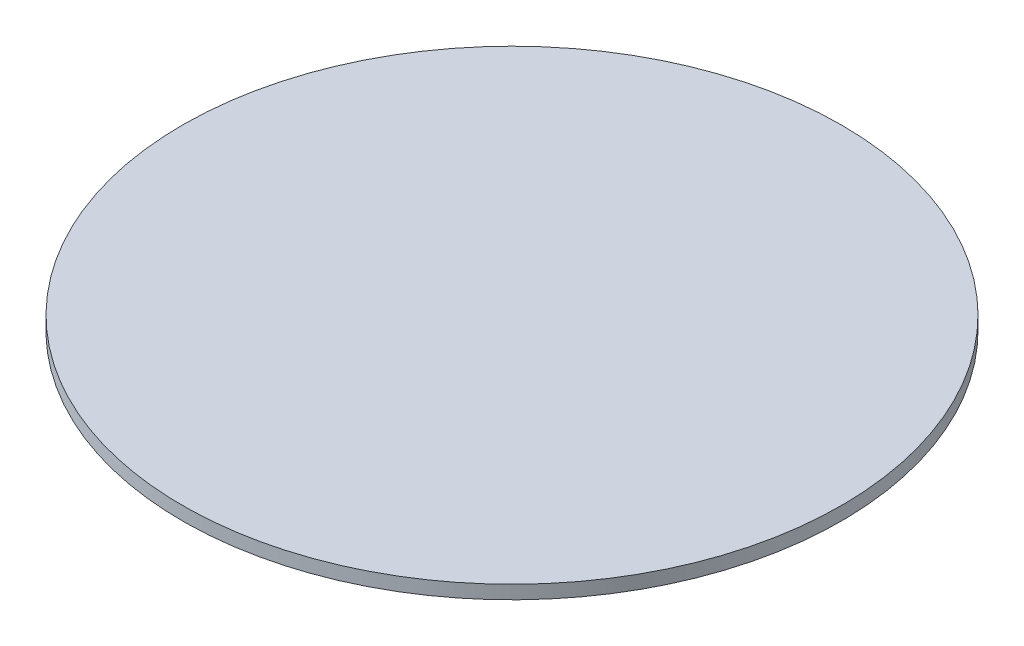
ISO-10303-21;
HEADER;
FILE_DESCRIPTION(('STEP AP214'),'2;1');
FILE_NAME('part.step','',(''),(''),'','','');
FILE_SCHEMA(('AUTOMOTIVE_DESIGN { 1 0 10303 214 1 1 1 1 }'));
ENDSEC;
DATA;
#1=APPLICATION_CONTEXT('core data for automotive mechanical design processes');
#2=APPLICATION_PROTOCOL_DEFINITION('international standard','automotive_design',2000,#1);
#3=PRODUCT_CONTEXT('',#1,'mechanical');
#4=PRODUCT('Part','Part','',(#3));
#5=PRODUCT_RELATED_PRODUCT_CATEGORY('part','',(#4));
#6=PRODUCT_DEFINITION_FORMATION('','',#4);
#7=PRODUCT_DEFINITION_CONTEXT('part definition',#1,'design');
#8=PRODUCT_DEFINITION('design','',#6,#7);
#9=PRODUCT_DEFINITION_SHAPE('','',#8);
#10=(LENGTH_UNIT() NAMED_UNIT(*) SI_UNIT(.MILLI.,.METRE.));
#11=(NAMED_UNIT(*) PLANE_ANGLE_UNIT() SI_UNIT($,.RADIAN.));
#12=(NAMED_UNIT(*) SI_UNIT($,.STERADIAN.) SOLID_ANGLE_UNIT());
#13=UNCERTAINTY_MEASURE_WITH_UNIT(LENGTH_MEASURE(1.E-05),#10,'distance_accuracy_value','');
#14=(GEOMETRIC_REPRESENTATION_CONTEXT(3) GLOBAL_UNCERTAINTY_ASSIGNED_CONTEXT((#13)) GLOBAL_UNIT_ASSIGNED_CONTEXT((#10,
#11,#12)) REPRESENTATION_CONTEXT('',''));
#15=CARTESIAN_POINT('',(0.,0.,0.));
#16=DIRECTION('',(0.,0.,1.));
#17=DIRECTION('',(1.,0.,0.));
#18=AXIS2_PLACEMENT_3D('',#15,#16,#17);
#19=CARTESIAN_POINT('',(0.,1.13671342881194,-27.7636753236815));
#20=CARTESIAN_POINT('',(-1.81711322679221,1.13671342881194,-27.7636753236815));
#21=CARTESIAN_POINT('',(-5.45133968037664,1.13671342881194,-27.4057352601502));
#22=CARTESIAN_POINT('',(-10.6931874339829,1.13671342881194,-25.8156381281192));
#23=CARTESIAN_POINT('',(-15.5241019913098,1.13671342881194,-23.2334605004011));
#24=CARTESIAN_POINT('',(-19.7584340151274,1.13671342881194,-19.7584340151274));
#25=CARTESIAN_POINT('',(-23.2334605004011,1.13671342881194,-15.5241019913099));
#26=CARTESIAN_POINT('',(-25.8156381281191,1.13671342881194,-10.6931874339829));
#27=CARTESIAN_POINT('',(-27.4057352601502,1.13671342881194,-5.45133968037665));
#28=CARTESIAN_POINT('',(-27.9426453554471,1.13671342881194,0.));
#29=CARTESIAN_POINT('',(-27.4057352601502,1.13671342881194,5.45133968037665));
#30=CARTESIAN_POINT('',(-25.8156381281192,1.13671342881194,10.6931874339829));
#31=CARTESIAN_POINT('',(-23.2334605004011,1.13671342881194,15.5241019913099));
#32=CARTESIAN_POINT('',(-19.7584340151274,1.13671342881194,19.7584340151274));
#33=CARTESIAN_POINT('',(-15.5241019913099,1.13671342881194,23.2334605004011));
#34=CARTESIAN_POINT('',(-10.6931874339829,1.13671342881194,25.8156381281191));
#35=CARTESIAN_POINT('',(-5.45133968037666,1.13671342881194,27.4057352601502));
#36=CARTESIAN_POINT('',(0.,1.13671342881194,27.9426453554471));
#37=CARTESIAN_POINT('',(5.45133968037663,1.13671342881194,27.4057352601502));
#38=CARTESIAN_POINT('',(10.6931874339829,1.13671342881194,25.8156381281191));
#39=CARTESIAN_POINT('',(15.5241019913098,1.13671342881194,23.2334605004011));
#40=CARTESIAN_POINT('',(19.7584340151274,1.13671342881194,19.7584340151274));
#41=CARTESIAN_POINT('',(23.2334605004011,1.13671342881194,15.5241019913099));
#42=CARTESIAN_POINT('',(25.8156381281192,1.13671342881194,10.6931874339829));
#43=CARTESIAN_POINT('',(27.4057352601502,1.13671342881194,5.45133968037666));
#44=CARTESIAN_POINT('',(27.9426453554471,1.13671342881194,0.));
#45=CARTESIAN_POINT('',(27.4057352601502,1.13671342881194,-5.45133968037665));
#46=CARTESIAN_POINT('',(25.8156381281191,1.13671342881194,-10.6931874339829));
#47=CARTESIAN_POINT('',(23.2334605004011,1.13671342881194,-15.5241019913099));
#48=CARTESIAN_POINT('',(19.7584340151274,1.13671342881194,-19.7584340151274));
#49=CARTESIAN_POINT('',(15.5241019913099,1.13671342881194,-23.2334605004011));
#50=CARTESIAN_POINT('',(10.6931874339829,1.13671342881194,-25.8156381281191));
#51=CARTESIAN_POINT('',(5.45133968037665,1.13671342881194,-27.4057352601502));
#52=CARTESIAN_POINT('',(1.81711322679222,1.13671342881194,-27.7636753236815));
#53=CARTESIAN_POINT('',(0.,1.13671342881194,-27.7636753236815));
#54=B_SPLINE_CURVE_WITH_KNOTS('',3,(#19,#20,#21,#22,#23,#24,#25,#26,#27,#28,#29,#30,#31,#32,#33,
#34,#35,#36,#37,#38,#39,#40,#41,#42,#43,#44,#45,#46,#47,#48,#49,#50,#51,#52,#53),.UNSPECIFIED.,
.T.,.F.,(4,1,1,1,1,1,1,1,1,1,1,1,1,1,1,1,1,1,1,1,1,1,1,1,1,1,1,1,1,1,1,1,4),(0.,0.03125,0.0625,
0.0937499999999999,0.125,0.15625,0.1875,0.21875,0.25,0.28125,0.3125,0.34375,0.375,0.40625,
0.4375,0.46875,0.5,0.53125,0.5625,0.59375,0.625,0.65625,0.687499999999999,0.71875,0.75,0.78125,
0.8125,0.84375,0.875,0.90625,0.9375,0.96875,1.),.UNSPECIFIED.);
#55=DIRECTION('',(0.,-1.,0.));
#56=VECTOR('',#55,1.);
#57=SURFACE_OF_LINEAR_EXTRUSION('',#54,#56);
#58=CARTESIAN_POINT('',(0.,1.13671342881194,-27.7636753236815));
#59=CARTESIAN_POINT('',(0.454281096131213,1.13671342881194,-27.7636752294538));
#60=CARTESIAN_POINT('',(0.908558886062405,1.13671342881194,-27.752489563112));
#61=CARTESIAN_POINT('',(1.81602337486819,1.13671342881194,-27.7078546133229));
#62=CARTESIAN_POINT('',(2.26921006523989,1.13671342881194,-27.6744051569351));
#63=CARTESIAN_POINT('',(3.17340078485465,1.13671342881194,-27.5853501575235));
#64=CARTESIAN_POINT('',(3.6244048140977,1.13671342881194,-27.5297446144998));
#65=CARTESIAN_POINT('',(4.52314141363615,1.13671342881194,-27.3964842304895));
#66=CARTESIAN_POINT('',(4.97087400931646,1.13671342881194,-27.3188295607814));
#67=CARTESIAN_POINT('',(5.86197470918004,1.13671342881194,-27.1415786139409));
#68=CARTESIAN_POINT('',(6.30534281336331,1.13671342881194,-27.0419823368084));
#69=CARTESIAN_POINT('',(7.18666376791498,1.13671342881194,-26.8211672468906));
#70=CARTESIAN_POINT('',(7.62461657619154,1.13671342881194,-26.6999482661498));
#71=CARTESIAN_POINT('',(8.49405949137429,1.13671342881194,-26.436205641602));
#72=CARTESIAN_POINT('',(8.92554959828047,1.13671342881194,-26.2936819977951));
#73=CARTESIAN_POINT('',(9.781019485786,1.13671342881194,-25.9876473442199));
#74=CARTESIAN_POINT('',(10.2049993246982,1.13671342881194,-25.8241364974864));
#75=CARTESIAN_POINT('',(11.0443978111745,1.13671342881194,-25.4764462601895));
#76=CARTESIAN_POINT('',(11.4598164587386,1.13671342881194,-25.2922668696261));
#77=CARTESIAN_POINT('',(12.2811241963695,1.13671342881194,-24.903757489638));
#78=CARTESIAN_POINT('',(12.6870132123867,1.13671342881194,-24.6994273436969));
#79=CARTESIAN_POINT('',(13.4882963908315,1.13671342881194,-24.2711325617716));
#80=CARTESIAN_POINT('',(13.8836905532591,1.13671342881194,-24.0471679257874));
#81=CARTESIAN_POINT('',(14.6630184280044,1.13671342881194,-23.5801197463469));
#82=CARTESIAN_POINT('',(15.046952229321,1.13671342881194,-23.3370363514165));
#83=CARTESIAN_POINT('',(15.8023909087956,1.13671342881194,-22.8322683635339));
#84=CARTESIAN_POINT('',(16.1738957869535,1.13671342881194,-22.5705837705818));
#85=CARTESIAN_POINT('',(16.9036279066813,1.13671342881194,-22.0293102983756));
#86=CARTESIAN_POINT('',(17.2618550450895,1.13671342881194,-21.7497212800587));
#87=CARTESIAN_POINT('',(17.9641856250122,1.13671342881194,-21.1733334689657));
#88=CARTESIAN_POINT('',(18.3082890665268,1.13671342881194,-20.8765346761897));
#89=CARTESIAN_POINT('',(18.9815257949626,1.13671342881194,-20.2664213705146));
#90=CARTESIAN_POINT('',(19.3106591981488,1.13671342881194,-19.9531069859248));
#91=CARTESIAN_POINT('',(19.9531069859248,1.13671342881194,-19.3106591981488));
#92=CARTESIAN_POINT('',(20.2664213705146,1.13671342881194,-18.9815257949627));
#93=CARTESIAN_POINT('',(20.8765346761896,1.13671342881194,-18.3082890665268));
#94=CARTESIAN_POINT('',(21.1733334689657,1.13671342881194,-17.9641856250122));
#95=CARTESIAN_POINT('',(21.7497212800587,1.13671342881194,-17.2618550450895));
#96=CARTESIAN_POINT('',(22.0293102983755,1.13671342881194,-16.9036279066814));
#97=CARTESIAN_POINT('',(22.5705837705818,1.13671342881194,-16.1738957869535));
#98=CARTESIAN_POINT('',(22.8322683635339,1.13671342881194,-15.8023909087953));
#99=CARTESIAN_POINT('',(23.3370363514164,1.13671342881194,-15.0469522293213));
#100=CARTESIAN_POINT('',(23.5801197463469,1.13671342881194,-14.6630184280054));
#101=CARTESIAN_POINT('',(24.0471679257875,1.13671342881194,-13.8836905532582));
#102=CARTESIAN_POINT('',(24.2711325617718,1.13671342881194,-13.4882963908279));
#103=CARTESIAN_POINT('',(24.6994273436967,1.13671342881194,-12.6870132123904));
#104=CARTESIAN_POINT('',(24.9037574896373,1.13671342881194,-12.2811241963831));
#105=CARTESIAN_POINT('',(25.2922668696267,1.13671342881194,-11.459816458725));
#106=CARTESIAN_POINT('',(25.476446260192,1.13671342881194,-11.0443978111238));
#107=CARTESIAN_POINT('',(25.8241364974839,1.13671342881194,-10.204999324749));
#108=CARTESIAN_POINT('',(25.9876473442105,1.13671342881194,-9.78101948597532));
#109=CARTESIAN_POINT('',(26.2936819978044,1.13671342881194,-8.92554959809121));
#110=CARTESIAN_POINT('',(26.4362056416369,1.13671342881194,-8.49405949066786));
#111=CARTESIAN_POINT('',(26.6999482661149,1.13671342881194,-7.62461657689804));
#112=CARTESIAN_POINT('',(26.8211672467604,1.13671342881194,-7.18666377055157));
#113=CARTESIAN_POINT('',(27.0419823369386,1.13671342881194,-6.30534281072682));
#114=CARTESIAN_POINT('',(27.1415786144266,1.13671342881194,-5.86197469934046));
#115=CARTESIAN_POINT('',(27.3188295602957,1.13671342881194,-4.97087401915613));
#116=CARTESIAN_POINT('',(27.3964842286768,1.13671342881194,-4.52314145035816));
#117=CARTESIAN_POINT('',(27.5297446163126,1.13671342881194,-3.62440477737549));
#118=CARTESIAN_POINT('',(27.5853501642889,1.13671342881194,-3.17340064780488));
#119=CARTESIAN_POINT('',(27.6744051501698,1.13671342881194,-2.26921020228976));
#120=CARTESIAN_POINT('',(27.7078545880744,1.13671342881194,-1.81602388634525));
#121=CARTESIAN_POINT('',(27.7524895883603,1.13671342881194,-0.908558374589416));
#122=CARTESIAN_POINT('',(27.7636753236815,1.13671342881194,-0.454279187294735));
#123=CARTESIAN_POINT('',(27.7636753236815,1.13671342881194,0.454279187294627));
#124=CARTESIAN_POINT('',(27.7524895883603,1.13671342881194,0.908558374589308));
#125=CARTESIAN_POINT('',(27.7078545880744,1.13671342881194,1.81602388634514));
#126=CARTESIAN_POINT('',(27.6744051501698,1.13671342881194,2.26921020228965));
#127=CARTESIAN_POINT('',(27.5853501642889,1.13671342881194,3.17340064780477));
#128=CARTESIAN_POINT('',(27.5297446163126,1.13671342881194,3.62440477737539));
#129=CARTESIAN_POINT('',(27.3964842286768,1.13671342881194,4.52314145035806));
#130=CARTESIAN_POINT('',(27.3188295602957,1.13671342881194,4.97087401915602));
#131=CARTESIAN_POINT('',(27.1415786144266,1.13671342881194,5.86197469934035));
#132=CARTESIAN_POINT('',(27.0419823369386,1.13671342881194,6.30534281072672));
#133=CARTESIAN_POINT('',(26.8211672467604,1.13671342881194,7.18666377055147));
#134=CARTESIAN_POINT('',(26.6999482661149,1.13671342881194,7.62461657689794));
#135=CARTESIAN_POINT('',(26.4362056416369,1.13671342881194,8.49405949066776));
#136=CARTESIAN_POINT('',(26.2936819978045,1.13671342881194,8.9255495980911));
#137=CARTESIAN_POINT('',(25.9876473442106,1.13671342881194,9.78101948597522));
#138=CARTESIAN_POINT('',(25.824136497484,1.13671342881194,10.2049993247489));
#139=CARTESIAN_POINT('',(25.4764462601921,1.13671342881194,11.0443978111237));
#140=CARTESIAN_POINT('',(25.2922668696268,1.13671342881194,11.4598164587249));
#141=CARTESIAN_POINT('',(24.9037574896374,1.13671342881194,12.281124196383));
#142=CARTESIAN_POINT('',(24.6994273436967,1.13671342881194,12.6870132123903));
#143=CARTESIAN_POINT('',(24.2711325617718,1.13671342881194,13.4882963908278));
#144=CARTESIAN_POINT('',(24.0471679257875,1.13671342881194,13.8836905532581));
#145=CARTESIAN_POINT('',(23.5801197463469,1.13671342881194,14.6630184280053));
#146=CARTESIAN_POINT('',(23.3370363514165,1.13671342881194,15.0469522293212));
#147=CARTESIAN_POINT('',(22.8322683635339,1.13671342881194,15.8023909087953));
#148=CARTESIAN_POINT('',(22.5705837705819,1.13671342881194,16.1738957869534));
#149=CARTESIAN_POINT('',(22.0293102983756,1.13671342881194,16.9036279066813));
#150=CARTESIAN_POINT('',(21.7497212800587,1.13671342881194,17.2618550450895));
#151=CARTESIAN_POINT('',(21.1733334689658,1.13671342881194,17.9641856250122));
#152=CARTESIAN_POINT('',(20.8765346761897,1.13671342881194,18.3082890665267));
#153=CARTESIAN_POINT('',(20.2664213705146,1.13671342881194,18.9815257949626));
#154=CARTESIAN_POINT('',(19.9531069859248,1.13671342881194,19.3106591981488));
#155=CARTESIAN_POINT('',(19.3106591981488,1.13671342881194,19.9531069859247));
#156=CARTESIAN_POINT('',(18.9815257949627,1.13671342881194,20.2664213705145));
#157=CARTESIAN_POINT('',(18.3082890665268,1.13671342881194,20.8765346761896));
#158=CARTESIAN_POINT('',(17.9641856250123,1.13671342881194,21.1733334689657));
#159=CARTESIAN_POINT('',(17.2618550450896,1.13671342881194,21.7497212800587));
#160=CARTESIAN_POINT('',(16.9036279066814,1.13671342881194,22.0293102983755));
#161=CARTESIAN_POINT('',(16.1738957869535,1.13671342881194,22.5705837705818));
#162=CARTESIAN_POINT('',(15.8023909087954,1.13671342881194,22.8322683635339));
#163=CARTESIAN_POINT('',(15.0469522293213,1.13671342881194,23.3370363514164));
#164=CARTESIAN_POINT('',(14.6630184280054,1.13671342881194,23.5801197463468));
#165=CARTESIAN_POINT('',(13.8836905532582,1.13671342881194,24.0471679257875));
#166=CARTESIAN_POINT('',(13.4882963908279,1.13671342881194,24.2711325617718));
#167=CARTESIAN_POINT('',(12.6870132123904,1.13671342881194,24.6994273436967));
#168=CARTESIAN_POINT('',(12.2811241963831,1.13671342881194,24.9037574896373));
#169=CARTESIAN_POINT('',(11.459816458725,1.13671342881194,25.2922668696267));
#170=CARTESIAN_POINT('',(11.0443978111238,1.13671342881194,25.476446260192));
#171=CARTESIAN_POINT('',(10.204999324749,1.13671342881194,25.8241364974839));
#172=CARTESIAN_POINT('',(9.78101948597534,1.13671342881194,25.9876473442105));
#173=CARTESIAN_POINT('',(8.92554959809122,1.13671342881194,26.2936819978044));
#174=CARTESIAN_POINT('',(8.49405949066788,1.13671342881194,26.4362056416369));
#175=CARTESIAN_POINT('',(7.62461657689805,1.13671342881194,26.6999482661149));
#176=CARTESIAN_POINT('',(7.18666377055158,1.13671342881194,26.8211672467604));
#177=CARTESIAN_POINT('',(6.30534281072683,1.13671342881194,27.0419823369386));
#178=CARTESIAN_POINT('',(5.86197469934046,1.13671342881194,27.1415786144266));
#179=CARTESIAN_POINT('',(4.97087401915613,1.13671342881194,27.3188295602957));
#180=CARTESIAN_POINT('',(4.52314145035816,1.13671342881194,27.3964842286768));
#181=CARTESIAN_POINT('',(3.62440477737549,1.13671342881194,27.5297446163125));
#182=CARTESIAN_POINT('',(3.17340064780488,1.13671342881194,27.5853501642889));
#183=CARTESIAN_POINT('',(2.26921020228975,1.13671342881194,27.6744051501698));
#184=CARTESIAN_POINT('',(1.81602388634525,1.13671342881194,27.7078545880744));
#185=CARTESIAN_POINT('',(0.908558374589408,1.13671342881194,27.7524895883603));
#186=CARTESIAN_POINT('',(0.454279187294726,1.13671342881194,27.7636753236815));
#187=CARTESIAN_POINT('',(-0.454279187294637,1.13671342881194,27.7636753236815));
#188=CARTESIAN_POINT('',(-0.90855837458932,1.13671342881194,27.7524895883603));
#189=CARTESIAN_POINT('',(-1.81602388634516,1.13671342881194,27.7078545880744));
#190=CARTESIAN_POINT('',(-2.26921020228967,1.13671342881194,27.6744051501698));
#191=CARTESIAN_POINT('',(-3.17340064780479,1.13671342881194,27.5853501642889));
#192=CARTESIAN_POINT('',(-3.62440477737541,1.13671342881194,27.5297446163126));
#193=CARTESIAN_POINT('',(-4.52314145035808,1.13671342881194,27.3964842286768));
#194=CARTESIAN_POINT('',(-4.97087401915605,1.13671342881194,27.3188295602957));
#195=CARTESIAN_POINT('',(-5.86197469934038,1.13671342881194,27.1415786144266));
#196=CARTESIAN_POINT('',(-6.30534281072675,1.13671342881194,27.0419823369386));
#197=CARTESIAN_POINT('',(-7.1866637705515,1.13671342881194,26.8211672467604));
#198=CARTESIAN_POINT('',(-7.62461657689797,1.13671342881194,26.6999482661149));
#199=CARTESIAN_POINT('',(-8.49405949066779,1.13671342881194,26.4362056416369));
#200=CARTESIAN_POINT('',(-8.92554959809114,1.13671342881194,26.2936819978045));
#201=CARTESIAN_POINT('',(-9.78101948597526,1.13671342881194,25.9876473442106));
#202=CARTESIAN_POINT('',(-10.2049993247489,1.13671342881194,25.8241364974839));
#203=CARTESIAN_POINT('',(-11.0443978111238,1.13671342881194,25.476446260192));
#204=CARTESIAN_POINT('',(-11.4598164587249,1.13671342881194,25.2922668696268));
#205=CARTESIAN_POINT('',(-12.281124196383,1.13671342881194,24.9037574896373));
#206=CARTESIAN_POINT('',(-12.6870132123903,1.13671342881194,24.6994273436967));
#207=CARTESIAN_POINT('',(-13.4882963908279,1.13671342881194,24.2711325617718));
#208=CARTESIAN_POINT('',(-13.8836905532581,1.13671342881194,24.0471679257875));
#209=CARTESIAN_POINT('',(-14.6630184280053,1.13671342881194,23.5801197463469));
#210=CARTESIAN_POINT('',(-15.0469522293212,1.13671342881194,23.3370363514165));
#211=CARTESIAN_POINT('',(-15.8023909087953,1.13671342881194,22.8322683635339));
#212=CARTESIAN_POINT('',(-16.1738957869534,1.13671342881194,22.5705837705818));
#213=CARTESIAN_POINT('',(-16.9036279066813,1.13671342881194,22.0293102983756));
#214=CARTESIAN_POINT('',(-17.2618550450895,1.13671342881194,21.7497212800587));
#215=CARTESIAN_POINT('',(-17.9641856250122,1.13671342881194,21.1733334689657));
#216=CARTESIAN_POINT('',(-18.3082890665267,1.13671342881194,20.8765346761897));
#217=CARTESIAN_POINT('',(-18.9815257949626,1.13671342881194,20.2664213705146));
#218=CARTESIAN_POINT('',(-19.3106591981488,1.13671342881194,19.9531069859248));
#219=CARTESIAN_POINT('',(-19.9531069859247,1.13671342881194,19.3106591981488));
#220=CARTESIAN_POINT('',(-20.2664213705146,1.13671342881194,18.9815257949627));
#221=CARTESIAN_POINT('',(-20.8765346761896,1.13671342881194,18.3082890665268));
#222=CARTESIAN_POINT('',(-21.1733334689657,1.13671342881194,17.9641856250122));
#223=CARTESIAN_POINT('',(-21.7497212800587,1.13671342881194,17.2618550450895));
#224=CARTESIAN_POINT('',(-22.0293102983755,1.13671342881194,16.9036279066814));
#225=CARTESIAN_POINT('',(-22.5705837705818,1.13671342881194,16.1738957869535));
#226=CARTESIAN_POINT('',(-22.8322683635339,1.13671342881194,15.8023909087954));
#227=CARTESIAN_POINT('',(-23.3370363514164,1.13671342881194,15.0469522293213));
#228=CARTESIAN_POINT('',(-23.5801197463468,1.13671342881194,14.6630184280054));
#229=CARTESIAN_POINT('',(-24.0471679257875,1.13671342881194,13.8836905532582));
#230=CARTESIAN_POINT('',(-24.2711325617718,1.13671342881194,13.4882963908279));
#231=CARTESIAN_POINT('',(-24.6994273436967,1.13671342881194,12.6870132123904));
#232=CARTESIAN_POINT('',(-24.9037574896373,1.13671342881194,12.2811241963831));
#233=CARTESIAN_POINT('',(-25.2922668696267,1.13671342881194,11.459816458725));
#234=CARTESIAN_POINT('',(-25.476446260192,1.13671342881194,11.0443978111238));
#235=CARTESIAN_POINT('',(-25.8241364974839,1.13671342881194,10.204999324749));
#236=CARTESIAN_POINT('',(-25.9876473442105,1.13671342881194,9.78101948597532));
#237=CARTESIAN_POINT('',(-26.2936819978045,1.13671342881194,8.9255495980912));
#238=CARTESIAN_POINT('',(-26.4362056416369,1.13671342881194,8.49405949066785));
#239=CARTESIAN_POINT('',(-26.6999482661149,1.13671342881194,7.62461657689803));
#240=CARTESIAN_POINT('',(-26.8211672467604,1.13671342881194,7.18666377055156));
#241=CARTESIAN_POINT('',(-27.0419823369386,1.13671342881194,6.30534281072681));
#242=CARTESIAN_POINT('',(-27.1415786144266,1.13671342881194,5.86197469934045));
#243=CARTESIAN_POINT('',(-27.3188295602957,1.13671342881194,4.97087401915611));
#244=CARTESIAN_POINT('',(-27.3964842286768,1.13671342881194,4.52314145035815));
#245=CARTESIAN_POINT('',(-27.5297446163126,1.13671342881194,3.62440477737548));
#246=CARTESIAN_POINT('',(-27.5853501642889,1.13671342881194,3.17340064780486));
#247=CARTESIAN_POINT('',(-27.6744051501698,1.13671342881194,2.26921020228974));
#248=CARTESIAN_POINT('',(-27.7078545880744,1.13671342881194,1.81602388634523));
#249=CARTESIAN_POINT('',(-27.7524895883603,1.13671342881194,0.908558374589389));
#250=CARTESIAN_POINT('',(-27.7636753236815,1.13671342881194,0.454279187294706));
#251=CARTESIAN_POINT('',(-27.7636753236815,1.13671342881194,-0.454279187294658));
#252=CARTESIAN_POINT('',(-27.7524895883603,1.13671342881194,-0.90855837458934));
#253=CARTESIAN_POINT('',(-27.7078545880744,1.13671342881194,-1.81602388634518));
#254=CARTESIAN_POINT('',(-27.6744051501698,1.13671342881194,-2.26921020228969));
#255=CARTESIAN_POINT('',(-27.5853501642889,1.13671342881194,-3.17340064780481));
#256=CARTESIAN_POINT('',(-27.5297446163126,1.13671342881194,-3.62440477737543));
#257=CARTESIAN_POINT('',(-27.3964842286768,1.13671342881194,-4.5231414503581));
#258=CARTESIAN_POINT('',(-27.3188295602957,1.13671342881194,-4.97087401915606));
#259=CARTESIAN_POINT('',(-27.1415786144266,1.13671342881194,-5.8619746993404));
#260=CARTESIAN_POINT('',(-27.0419823369386,1.13671342881194,-6.30534281072676));
#261=CARTESIAN_POINT('',(-26.8211672467604,1.13671342881194,-7.18666377055151));
#262=CARTESIAN_POINT('',(-26.6999482661149,1.13671342881194,-7.62461657689799));
#263=CARTESIAN_POINT('',(-26.4362056416369,1.13671342881194,-8.49405949066781));
#264=CARTESIAN_POINT('',(-26.2936819978045,1.13671342881194,-8.92554959809116));
#265=CARTESIAN_POINT('',(-25.9876473442106,1.13671342881194,-9.78101948597527));
#266=CARTESIAN_POINT('',(-25.8241364974839,1.13671342881194,-10.2049993247489));
#267=CARTESIAN_POINT('',(-25.476446260192,1.13671342881194,-11.0443978111238));
#268=CARTESIAN_POINT('',(-25.2922668696267,1.13671342881194,-11.4598164587249));
#269=CARTESIAN_POINT('',(-24.9037574896373,1.13671342881194,-12.281124196383));
#270=CARTESIAN_POINT('',(-24.6994273436967,1.13671342881194,-12.6870132123903));
#271=CARTESIAN_POINT('',(-24.2711325617718,1.13671342881194,-13.4882963908279));
#272=CARTESIAN_POINT('',(-24.0471679257875,1.13671342881194,-13.8836905532581));
#273=CARTESIAN_POINT('',(-23.5801197463469,1.13671342881194,-14.6630184280053));
#274=CARTESIAN_POINT('',(-23.3370363514164,1.13671342881194,-15.0469522293213));
#275=CARTESIAN_POINT('',(-22.8322683635339,1.13671342881194,-15.8023909087953));
#276=CARTESIAN_POINT('',(-22.5705837705818,1.13671342881194,-16.1738957869534));
#277=CARTESIAN_POINT('',(-22.0293102983756,1.13671342881194,-16.9036279066814));
#278=CARTESIAN_POINT('',(-21.7497212800587,1.13671342881194,-17.2618550450895));
#279=CARTESIAN_POINT('',(-21.1733334689657,1.13671342881194,-17.9641856250122));
#280=CARTESIAN_POINT('',(-20.8765346761897,1.13671342881194,-18.3082890665268));
#281=CARTESIAN_POINT('',(-20.2664213705146,1.13671342881194,-18.9815257949626));
#282=CARTESIAN_POINT('',(-19.9531069859248,1.13671342881194,-19.3106591981488));
#283=CARTESIAN_POINT('',(-19.3106591981488,1.13671342881194,-19.9531069859248));
#284=CARTESIAN_POINT('',(-18.9815257949626,1.13671342881194,-20.2664213705146));
#285=CARTESIAN_POINT('',(-18.3082890665268,1.13671342881194,-20.8765346761896));
#286=CARTESIAN_POINT('',(-17.9641856250122,1.13671342881194,-21.1733334689657));
#287=CARTESIAN_POINT('',(-17.2618550450895,1.13671342881194,-21.7497212800587));
#288=CARTESIAN_POINT('',(-16.9036279066813,1.13671342881194,-22.0293102983756));
#289=CARTESIAN_POINT('',(-16.1738957869535,1.13671342881194,-22.5705837705818));
#290=CARTESIAN_POINT('',(-15.8023909087956,1.13671342881194,-22.8322683635339));
#291=CARTESIAN_POINT('',(-15.046952229321,1.13671342881194,-23.3370363514164));
#292=CARTESIAN_POINT('',(-14.6630184280044,1.13671342881194,-23.5801197463469));
#293=CARTESIAN_POINT('',(-13.8836905532591,1.13671342881194,-24.0471679257874));
#294=CARTESIAN_POINT('',(-13.4882963908315,1.13671342881194,-24.2711325617716));
#295=CARTESIAN_POINT('',(-12.6870132123867,1.13671342881194,-24.6994273436969));
#296=CARTESIAN_POINT('',(-12.2811241963695,1.13671342881194,-24.903757489638));
#297=CARTESIAN_POINT('',(-11.4598164587386,1.13671342881194,-25.2922668696261));
#298=CARTESIAN_POINT('',(-11.0443978111745,1.13671342881194,-25.4764462601895));
#299=CARTESIAN_POINT('',(-10.2049993246982,1.13671342881194,-25.8241364974864));
#300=CARTESIAN_POINT('',(-9.78101948578601,1.13671342881194,-25.9876473442199));
#301=CARTESIAN_POINT('',(-8.92554959828048,1.13671342881194,-26.2936819977951));
#302=CARTESIAN_POINT('',(-8.4940594913743,1.13671342881194,-26.436205641602));
#303=CARTESIAN_POINT('',(-7.62461657619155,1.13671342881194,-26.6999482661498));
#304=CARTESIAN_POINT('',(-7.18666376791499,1.13671342881194,-26.8211672468906));
#305=CARTESIAN_POINT('',(-6.30534281336332,1.13671342881194,-27.0419823368084));
#306=CARTESIAN_POINT('',(-5.86197470918005,1.13671342881194,-27.1415786139409));
#307=CARTESIAN_POINT('',(-4.97087400931646,1.13671342881194,-27.3188295607815));
#308=CARTESIAN_POINT('',(-4.52314141363615,1.13671342881194,-27.3964842304895));
#309=CARTESIAN_POINT('',(-3.6244048140977,1.13671342881194,-27.5297446144998));
#310=CARTESIAN_POINT('',(-3.17340078485465,1.13671342881194,-27.5853501575235));
#311=CARTESIAN_POINT('',(-2.26921006523989,1.13671342881194,-27.6744051569351));
#312=CARTESIAN_POINT('',(-1.81602337486819,1.13671342881194,-27.7078546133229));
#313=CARTESIAN_POINT('',(-0.908558886062405,1.13671342881194,-27.752489563112));
#314=CARTESIAN_POINT('',(-0.454281096131213,1.13671342881194,-27.7636752294538));
#315=CARTESIAN_POINT('',(0.,1.13671342881194,-27.7636753236815));
#316=B_SPLINE_CURVE_WITH_KNOTS('',3,(#58,#59,#60,#61,#62,#63,#64,#65,#66,#67,#68,#69,#70,#71,
#72,#73,#74,#75,#76,#77,#78,#79,#80,#81,#82,#83,#84,#85,#86,#87,#88,#89,#90,#91,#92,#93,#94,#95,
#96,#97,#98,#99,#100,#101,#102,#103,#104,#105,#106,#107,#108,#109,#110,#111,#112,#113,#114,#115,
#116,#117,#118,#119,#120,#121,#122,#123,#124,#125,#126,#127,#128,#129,#130,#131,#132,#133,#134,
#135,#136,#137,#138,#139,#140,#141,#142,#143,#144,#145,#146,#147,#148,#149,#150,#151,#152,#153,
#154,#155,#156,#157,#158,#159,#160,#161,#162,#163,#164,#165,#166,#167,#168,#169,#170,#171,#172,
#173,#174,#175,#176,#177,#178,#179,#180,#181,#182,#183,#184,#185,#186,#187,#188,#189,#190,#191,
#192,#193,#194,#195,#196,#197,#198,#199,#200,#201,#202,#203,#204,#205,#206,#207,#208,#209,#210,
#211,#212,#213,#214,#215,#216,#217,#218,#219,#220,#221,#222,#223,#224,#225,#226,#227,#228,#229,
#230,#231,#232,#233,#234,#235,#236,#237,#238,#239,#240,#241,#242,#243,#244,#245,#246,#247,#248,
#249,#250,#251,#252,#253,#254,#255,#256,#257,#258,#259,#260,#261,#262,#263,#264,#265,#266,#267,
#268,#269,#270,#271,#272,#273,#274,#275,#276,#277,#278,#279,#280,#281,#282,#283,#284,#285,#286,
#287,#288,#289,#290,#291,#292,#293,#294,#295,#296,#297,#298,#299,#300,#301,#302,#303,#304,#305,
#306,#307,#308,#309,#310,#311,#312,#313,#314,#315),.UNSPECIFIED.,.F.,.F.,(4,2,2,2,2,2,2,2,2,2,2,
2,2,2,2,2,2,2,2,2,2,2,2,2,2,2,2,2,2,2,2,2,2,2,2,2,2,2,2,2,2,2,2,2,2,2,2,2,2,2,2,2,2,2,2,2,2,2,2,
2,2,2,2,2,2,2,2,2,2,2,2,2,2,2,2,2,2,2,2,2,2,2,2,2,2,2,2,2,2,2,2,2,2,2,2,2,2,2,2,2,2,2,2,2,2,2,2,
2,2,2,2,2,2,2,2,2,2,2,2,2,2,2,2,2,2,2,2,2,4),(0.,1.36270128190055,2.72541314911193,
4.08812501632331,5.45082629822386,6.81352758012441,8.17623944733579,9.53895131454717,
10.9016525964477,12.2643538783483,13.6270657455597,14.989777612771,16.3524788946716,
17.7151801765721,19.0778920437835,20.4406039109949,21.8033051928954,23.166006474796,
24.5287183420074,25.8914302092187,27.2541314911193,28.6168327730198,29.9795446402312,
31.3422565074426,32.7049577893432,34.0676590712437,35.4303709384551,36.7930828056665,
38.155784087567,39.5184853694676,40.8811972366789,42.2439091038903,43.6066103857909,
44.9693116676914,46.3320235349028,47.6947354021141,49.0574366840147,50.4201379659152,
51.7828498331266,53.145561700338,54.5082629822386,55.8709642641391,57.2336761313505,
58.5963879985619,59.9590892804624,61.321790562363,62.6845024295744,64.0472142967858,
65.4099155786863,66.7726168605869,68.1353287277983,69.4980405950096,70.8607418769102,
72.2234431588107,73.5861550260221,74.9488668932335,76.311568175134,77.6742694570346,
79.036981324246,80.3996931914574,81.7623944733579,83.1250957552585,84.4878076224698,
85.8505194896812,87.2132207715818,88.5759220534823,89.9386339206937,91.3013457879051,
92.6640470698057,94.0267483517062,95.3894602189176,96.752172086129,98.1148733680295,
99.4775746499301,100.840286517141,102.202998384353,103.565699666253,104.928400948154,
106.291112815365,107.653824682577,109.016525964477,110.379227246378,111.741939113589,
113.104650980801,114.467352262701,115.830053544602,117.192765411813,118.555477279024,
119.918178560925,121.280879842826,122.643591710037,124.006303577248,125.369004859149,
126.731706141049,128.094418008261,129.457129875472,130.819831157373,132.182532439273,
133.545244306485,134.907956173696,136.270657455597,137.633358737497,138.996070604708,
140.35878247192,141.72148375382,143.084185035721,144.446896902932,145.809608770144,
147.172310052044,148.535011333945,149.897723201156,151.260435068368,152.623136350268,
153.985837632169,155.34854949938,156.711261366591,158.073962648492,159.436663930393,
160.799375797604,162.162087664815,163.524788946716,164.887490228616,166.250202095828,
167.612913963039,168.97561524494,170.33831652684,171.701028394052,173.063740261263,
174.426441543164),.UNSPECIFIED.);
#317=CARTESIAN_POINT('',(0.,1.13671342881194,-27.7636753236815));
#318=VERTEX_POINT('',#317);
#319=EDGE_CURVE('E9',#318,#318,#316,.F.);
#320=ORIENTED_EDGE('',*,*,#319,.F.);
#321=EDGE_LOOP('',(#320));
#322=FACE_BOUND('',#321,.T.);
#323=CARTESIAN_POINT('',(0.,0.000999999999999916,-27.7636753236815));
#324=CARTESIAN_POINT('',(-1.81711322679221,0.00100000000000013,-27.7636753236815));
#325=CARTESIAN_POINT('',(-5.45133968037664,0.00100000000000035,-27.4057352601502));
#326=CARTESIAN_POINT('',(-10.6931874339829,0.00100000000000013,-25.8156381281192));
#327=CARTESIAN_POINT('',(-15.5241019913098,0.000999999999999916,-23.2334605004011));
#328=CARTESIAN_POINT('',(-19.7584340151274,0.000999999999999916,-19.7584340151274));
#329=CARTESIAN_POINT('',(-23.2334605004011,0.00100000000000035,-15.5241019913099));
#330=CARTESIAN_POINT('',(-25.8156381281191,0.00100000000000013,-10.6931874339829));
#331=CARTESIAN_POINT('',(-27.4057352601502,0.00100000000000013,-5.45133968037665));
#332=CARTESIAN_POINT('',(-27.9426453554471,0.00100000000000013,0.));
#333=CARTESIAN_POINT('',(-27.4057352601502,0.00100000000000013,5.45133968037665));
#334=CARTESIAN_POINT('',(-25.8156381281192,0.000999999999999916,10.6931874339829));
#335=CARTESIAN_POINT('',(-23.2334605004011,0.000999999999999916,15.5241019913099));
#336=CARTESIAN_POINT('',(-19.7584340151274,0.00100000000000013,19.7584340151274));
#337=CARTESIAN_POINT('',(-15.5241019913099,0.00100000000000013,23.2334605004011));
#338=CARTESIAN_POINT('',(-10.6931874339829,0.000999999999999916,25.8156381281191));
#339=CARTESIAN_POINT('',(-5.45133968037666,0.00100000000000057,27.4057352601502));
#340=CARTESIAN_POINT('',(0.,0.000999999999999916,27.9426453554471));
#341=CARTESIAN_POINT('',(5.45133968037663,0.000999999999999916,27.4057352601502));
#342=CARTESIAN_POINT('',(10.6931874339829,0.000999999999999916,25.8156381281191));
#343=CARTESIAN_POINT('',(15.5241019913098,0.00100000000000013,23.2334605004011));
#344=CARTESIAN_POINT('',(19.7584340151274,0.000999999999999916,19.7584340151274));
#345=CARTESIAN_POINT('',(23.2334605004011,0.00100000000000013,15.5241019913099));
#346=CARTESIAN_POINT('',(25.8156381281192,0.00100000000000035,10.6931874339829));
#347=CARTESIAN_POINT('',(27.4057352601502,0.00100000000000013,5.45133968037666));
#348=CARTESIAN_POINT('',(27.9426453554471,0.00100000000000035,0.));
#349=CARTESIAN_POINT('',(27.4057352601502,0.00100000000000013,-5.45133968037665));
#350=CARTESIAN_POINT('',(25.8156381281191,0.000999999999999916,-10.6931874339829));
#351=CARTESIAN_POINT('',(23.2334605004011,0.00100000000000013,-15.5241019913099));
#352=CARTESIAN_POINT('',(19.7584340151274,0.00100000000000035,-19.7584340151274));
#353=CARTESIAN_POINT('',(15.5241019913099,0.00100000000000035,-23.2334605004011));
#354=CARTESIAN_POINT('',(10.6931874339829,0.000999999999999916,-25.8156381281191));
#355=CARTESIAN_POINT('',(5.45133968037665,0.00100000000000013,-27.4057352601502));
#356=CARTESIAN_POINT('',(1.81711322679222,0.000999999999999916,-27.7636753236815));
#357=CARTESIAN_POINT('',(0.,0.000999999999999916,-27.7636753236815));
#358=B_SPLINE_CURVE_WITH_KNOTS('',3,(#323,#324,#325,#326,#327,#328,#329,#330,#331,#332,#333,
#334,#335,#336,#337,#338,#339,#340,#341,#342,#343,#344,#345,#346,#347,#348,#349,#350,#351,#352,
#353,#354,#355,#356,#357),.UNSPECIFIED.,.T.,.F.,(4,1,1,1,1,1,1,1,1,1,1,1,1,1,1,1,1,1,1,1,1,1,1,
1,1,1,1,1,1,1,1,1,4),(0.,0.03125,0.0625,0.0937499999999999,0.125,0.15625,0.1875,0.21875,0.25,
0.28125,0.3125,0.34375,0.375,0.40625,0.4375,0.46875,0.5,0.53125,0.5625,0.59375,0.625,0.65625,
0.687499999999999,0.71875,0.75,0.78125,0.8125,0.84375,0.875,0.90625,0.9375,0.96875,1.),.UNSPECIFIED.);
#359=CARTESIAN_POINT('',(0.,0.000999999999999916,-27.7636753236815));
#360=VERTEX_POINT('',#359);
#361=EDGE_CURVE('E24',#360,#360,#358,.T.);
#362=ORIENTED_EDGE('',*,*,#361,.T.);
#363=EDGE_LOOP('',(#362));
#364=FACE_BOUND('',#363,.T.);
#365=ADVANCED_FACE('F14',(#322,#364),#57,.F.);
#366=CARTESIAN_POINT('',(20.6973521348428,1.13671342881194,-17.3383855824675));
#367=DIRECTION('',(0.,-1.,0.));
#368=DIRECTION('',(1.,0.,0.));
#369=AXIS2_PLACEMENT_3D('',#366,#367,#368);
#370=PLANE('',#369);
#371=ORIENTED_EDGE('',*,*,#319,.T.);
#372=EDGE_LOOP('',(#371));
#373=FACE_BOUND('',#372,.T.);
#374=ADVANCED_FACE('F59',(#373),#370,.F.);
#375=CARTESIAN_POINT('',(20.6973521348428,0.001,-17.3383855824675));
#376=DIRECTION('',(0.,-1.,0.));
#377=DIRECTION('',(1.,0.,0.));
#378=AXIS2_PLACEMENT_3D('',#375,#376,#377);
#379=PLANE('',#378);
#380=ORIENTED_EDGE('',*,*,#361,.F.);
#381=EDGE_LOOP('',(#380));
#382=FACE_BOUND('',#381,.T.);
#383=ADVANCED_FACE('F67',(#382),#379,.T.);
#384=CLOSED_SHELL('',(#365,#374,#383));
#385=MANIFOLD_SOLID_BREP('B1',#384);
#386=ADVANCED_BREP_SHAPE_REPRESENTATION('',(#18,#385),#14);
#387=SHAPE_DEFINITION_REPRESENTATION(#9,#386);
ENDSEC;
END-ISO-10303-21;
